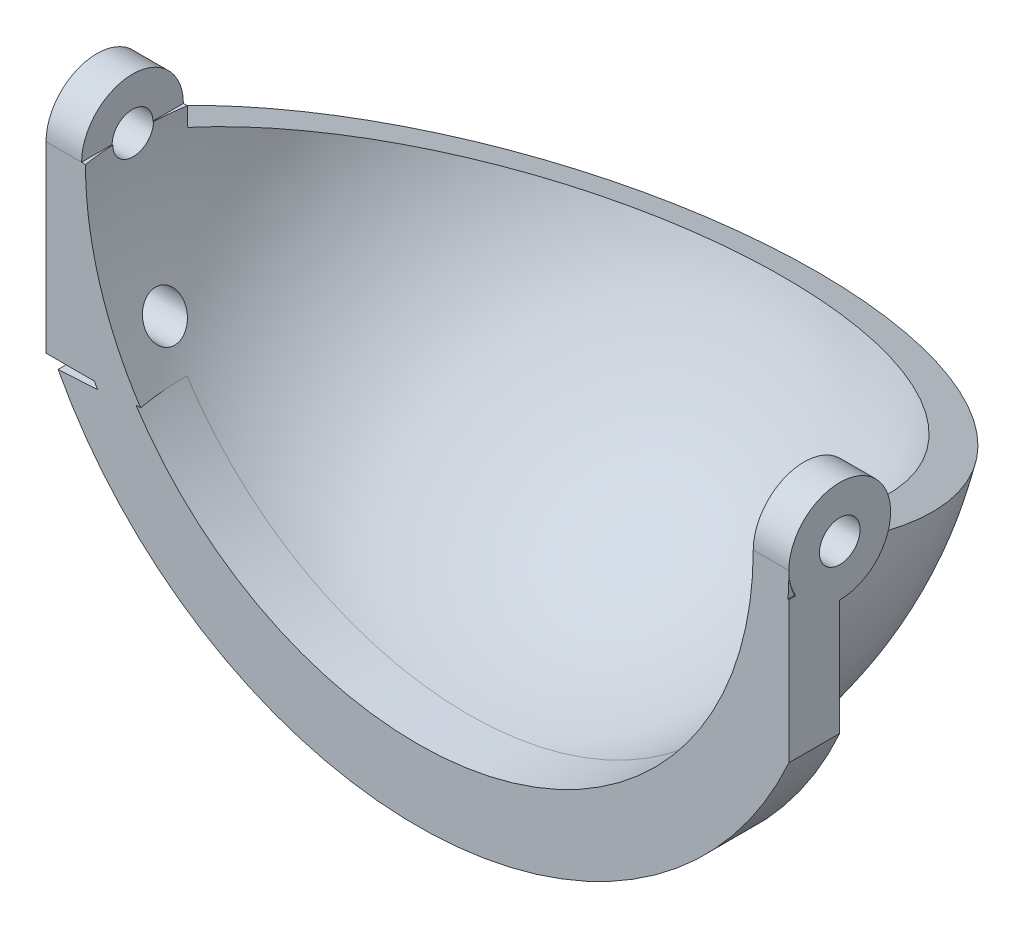
ISO-10303-21;
HEADER;
FILE_DESCRIPTION(('STEP AP214'),'2;1');
FILE_NAME('part.step','',(''),(''),'','','');
FILE_SCHEMA(('AUTOMOTIVE_DESIGN { 1 0 10303 214 1 1 1 1 }'));
ENDSEC;
DATA;
#1=APPLICATION_CONTEXT('core data for automotive mechanical design processes');
#2=APPLICATION_PROTOCOL_DEFINITION('international standard','automotive_design',2000,#1);
#3=PRODUCT_CONTEXT('',#1,'mechanical');
#4=PRODUCT('Part','Part','',(#3));
#5=PRODUCT_RELATED_PRODUCT_CATEGORY('part','',(#4));
#6=PRODUCT_DEFINITION_FORMATION('','',#4);
#7=PRODUCT_DEFINITION_CONTEXT('part definition',#1,'design');
#8=PRODUCT_DEFINITION('design','',#6,#7);
#9=PRODUCT_DEFINITION_SHAPE('','',#8);
#10=(LENGTH_UNIT() NAMED_UNIT(*) SI_UNIT(.MILLI.,.METRE.));
#11=(NAMED_UNIT(*) PLANE_ANGLE_UNIT() SI_UNIT($,.RADIAN.));
#12=(NAMED_UNIT(*) SI_UNIT($,.STERADIAN.) SOLID_ANGLE_UNIT());
#13=UNCERTAINTY_MEASURE_WITH_UNIT(LENGTH_MEASURE(1.E-05),#10,'distance_accuracy_value','');
#14=(GEOMETRIC_REPRESENTATION_CONTEXT(3) GLOBAL_UNCERTAINTY_ASSIGNED_CONTEXT((#13)) GLOBAL_UNIT_ASSIGNED_CONTEXT((#10,
#11,#12)) REPRESENTATION_CONTEXT('',''));
#15=CARTESIAN_POINT('',(0.,0.,0.));
#16=DIRECTION('',(0.,0.,1.));
#17=DIRECTION('',(1.,0.,0.));
#18=AXIS2_PLACEMENT_3D('',#15,#16,#17);
#19=CARTESIAN_POINT('',(0.,0.,2.5));
#20=DIRECTION('',(0.,0.,-1.));
#21=DIRECTION('',(-1.,0.,0.));
#22=AXIS2_PLACEMENT_3D('',#19,#20,#21);
#23=CYLINDRICAL_SURFACE('',#22,18.25);
#24=DIRECTION('',(0.,0.,-1.));
#25=VECTOR('',#24,1.);
#26=CARTESIAN_POINT('',(-15.7118029451725,-9.28448965813786,2.5));
#27=LINE('',#26,#25);
#28=CARTESIAN_POINT('',(-15.7118029451725,-9.28448965813786,2.5));
#29=VERTEX_POINT('',#28);
#30=CARTESIAN_POINT('',(-15.7118029451725,-9.28448965813786,0.));
#31=VERTEX_POINT('',#30);
#32=EDGE_CURVE('E228',#29,#31,#27,.T.);
#33=ORIENTED_EDGE('',*,*,#32,.F.);
#34=CARTESIAN_POINT('',(0.,0.,2.5));
#35=DIRECTION('',(0.,0.,1.));
#36=DIRECTION('',(1.,0.,0.));
#37=AXIS2_PLACEMENT_3D('',#34,#35,#36);
#38=CIRCLE('',#37,18.25);
#39=CARTESIAN_POINT('',(-15.8764763093074,-9.00000000000001,2.5));
#40=VERTEX_POINT('',#39);
#41=EDGE_CURVE('E385',#40,#29,#38,.T.);
#42=ORIENTED_EDGE('',*,*,#41,.F.);
#43=DIRECTION('',(0.,0.,-1.));
#44=VECTOR('',#43,1.);
#45=CARTESIAN_POINT('',(-15.8764763093074,-9.00000000000001,2.5));
#46=LINE('',#45,#44);
#47=CARTESIAN_POINT('',(-15.8764763093074,-9.00000000000001,0.));
#48=VERTEX_POINT('',#47);
#49=EDGE_CURVE('E292',#40,#48,#46,.T.);
#50=ORIENTED_EDGE('',*,*,#49,.T.);
#51=CARTESIAN_POINT('',(0.,0.,0.));
#52=DIRECTION('',(0.,0.,1.));
#53=DIRECTION('',(1.,0.,0.));
#54=AXIS2_PLACEMENT_3D('',#51,#52,#53);
#55=CIRCLE('',#54,18.25);
#56=EDGE_CURVE('E388',#48,#31,#55,.T.);
#57=ORIENTED_EDGE('',*,*,#56,.T.);
#58=EDGE_LOOP('',(#33,#42,#50,#57));
#59=FACE_BOUND('',#58,.T.);
#60=ADVANCED_FACE('F35',(#59),#23,.T.);
#61=DIRECTION('',(0.,0.,-1.));
#62=VECTOR('',#61,1.);
#63=CARTESIAN_POINT('',(18.2081881010628,-1.234660308066,2.5));
#64=LINE('',#63,#62);
#65=CARTESIAN_POINT('',(18.2081881010628,-1.234660308066,2.17384772320565));
#66=VERTEX_POINT('',#65);
#67=CARTESIAN_POINT('',(18.2081881010628,-1.234660308066,2.5));
#68=VERTEX_POINT('',#67);
#69=EDGE_CURVE('E193',#66,#68,#64,.F.);
#70=ORIENTED_EDGE('',*,*,#69,.F.);
#71=CARTESIAN_POINT('',(18.0779561897909,-2.5,0.));
#72=CARTESIAN_POINT('',(18.0779521570099,-2.50000712172084,0.0699656158708145));
#73=CARTESIAN_POINT('',(18.0783622769024,-2.49706294109357,0.139927587474474));
#74=CARTESIAN_POINT('',(18.0799810069445,-2.48532714554486,0.279344431731297));
#75=CARTESIAN_POINT('',(18.0811895507925,-2.47653601615712,0.348799346006648));
#76=CARTESIAN_POINT('',(18.0843735011698,-2.45317484259694,0.486635184812482));
#77=CARTESIAN_POINT('',(18.0863480290973,-2.43861141896833,0.555017246767177));
#78=CARTESIAN_POINT('',(18.0910036191342,-2.40382884624327,0.690282828633489));
#79=CARTESIAN_POINT('',(18.0936846778959,-2.3836097239455,0.75716635564407));
#80=CARTESIAN_POINT('',(18.1026816279781,-2.31464924061234,0.954905218171614));
#81=CARTESIAN_POINT('',(18.1099532632597,-2.25759117383518,1.08292849867273));
#82=CARTESIAN_POINT('',(18.126219441476,-2.12302381889561,1.32750969459837));
#83=CARTESIAN_POINT('',(18.1352139309721,-2.0455151650321,1.44406796546971));
#84=CARTESIAN_POINT('',(18.1539793096156,-1.87168459844453,1.66326956672154));
#85=CARTESIAN_POINT('',(18.16375443442,-1.77525523980031,1.76582747088945));
#86=CARTESIAN_POINT('',(18.1829430712477,-1.56653775618856,1.95336862147731));
#87=CARTESIAN_POINT('',(18.1923565138271,-1.45424660487692,2.03834850646377));
#88=CARTESIAN_POINT('',(18.209806264365,-1.21643593050015,2.18864276206281));
#89=CARTESIAN_POINT('',(18.217836596587,-1.09086261218281,2.25387267856655));
#90=CARTESIAN_POINT('',(18.2315610737766,-0.830441525078597,2.36225020163968));
#91=CARTESIAN_POINT('',(18.2372567095592,-0.695599739092576,2.40541190418471));
#92=CARTESIAN_POINT('',(18.2442634660599,-0.466632968904975,2.4578610049634));
#93=CARTESIAN_POINT('',(18.2464038580345,-0.373970279138573,2.47364943650924));
#94=CARTESIAN_POINT('',(18.2492766026278,-0.18755220887636,2.49471976005789));
#95=CARTESIAN_POINT('',(18.2500106778679,-0.0937983069053951,2.50001450622967));
#96=CARTESIAN_POINT('',(18.25,0.,2.5));
#97=B_SPLINE_CURVE_WITH_KNOTS('',3,(#71,#72,#73,#74,#75,#76,#77,#78,#79,#80,#81,#82,#83,#84,#85,
#86,#87,#88,#89,#90,#91,#92,#93,#94,#95,#96),.UNSPECIFIED.,.F.,.F.,(4,2,2,2,2,2,2,2,2,2,2,2,4),
(0.,0.20982725964795,0.419637097305098,0.629206986313711,0.838775882323268,1.2576742126176,
1.67655955181663,2.09789632693474,2.51931359968153,2.94250826673842,3.36543228128222,
3.64693451216615,3.92809170514547),.UNSPECIFIED.);
#98=CARTESIAN_POINT('',(18.25,0.,2.5));
#99=VERTEX_POINT('',#98);
#100=EDGE_CURVE('E335',#66,#99,#97,.T.);
#101=ORIENTED_EDGE('',*,*,#100,.T.);
#102=EDGE_CURVE('E397',#68,#99,#38,.T.);
#103=ORIENTED_EDGE('',*,*,#102,.F.);
#104=EDGE_LOOP('',(#70,#101,#103));
#105=FACE_BOUND('',#104,.T.);
#106=ADVANCED_FACE('F375',(#105),#23,.T.);
#107=CARTESIAN_POINT('',(-18.25,0.,0.));
#108=DIRECTION('',(1.,0.,0.));
#109=DIRECTION('',(0.,0.,-1.));
#110=AXIS2_PLACEMENT_3D('',#107,#108,#109);
#111=CYLINDRICAL_SURFACE('',#110,2.5);
#112=ORIENTED_EDGE('',*,*,#100,.F.);
#113=CARTESIAN_POINT('',(9.22059209697116,0.,0.));
#114=DIRECTION('',(-0.136095643510322,-0.990695702936836,0.));
#115=DIRECTION('',(0.990695702936836,-0.136095643510322,0.));
#116=AXIS2_PLACEMENT_3D('',#113,#114,#115);
#117=ELLIPSE('',#116,18.3694344324136,2.5);
#118=CARTESIAN_POINT('',(18.25,-1.24040416793677,2.17057538458472));
#119=VERTEX_POINT('',#118);
#120=EDGE_CURVE('E216',#66,#119,#117,.F.);
#121=ORIENTED_EDGE('',*,*,#120,.T.);
#122=CARTESIAN_POINT('',(18.25,0.,0.));
#123=DIRECTION('',(1.,0.,0.));
#124=DIRECTION('',(0.,0.,-1.));
#125=AXIS2_PLACEMENT_3D('',#122,#123,#124);
#126=CIRCLE('',#125,2.5);
#127=EDGE_CURVE('E179',#99,#119,#126,.T.);
#128=ORIENTED_EDGE('',*,*,#127,.F.);
#129=EDGE_LOOP('',(#112,#121,#128));
#130=FACE_BOUND('',#129,.T.);
#131=ADVANCED_FACE('F352',(#130),#111,.T.);
#132=CARTESIAN_POINT('',(18.25,0.,0.));
#133=DIRECTION('',(1.,0.,0.));
#134=DIRECTION('',(0.,0.,-1.));
#135=AXIS2_PLACEMENT_3D('',#132,#133,#134);
#136=PLANE('',#135);
#137=CARTESIAN_POINT('',(18.25,0.,0.));
#138=DIRECTION('',(1.,0.,0.));
#139=DIRECTION('',(0.,0.,-1.));
#140=AXIS2_PLACEMENT_3D('',#137,#138,#139);
#141=CIRCLE('',#140,1.);
#142=CARTESIAN_POINT('',(18.25,0.,-1.));
#143=VERTEX_POINT('',#142);
#144=EDGE_CURVE('E310',#143,#143,#141,.T.);
#145=ORIENTED_EDGE('',*,*,#144,.F.);
#146=EDGE_LOOP('',(#145));
#147=FACE_BOUND('',#146,.T.);
#148=ORIENTED_EDGE('',*,*,#127,.T.);
#149=DIRECTION('',(0.,0.,-1.));
#150=VECTOR('',#149,1.);
#151=CARTESIAN_POINT('',(18.25,-1.24040416793677,2.5));
#152=LINE('',#151,#150);
#153=CARTESIAN_POINT('',(18.25,-1.24040416793677,2.5));
#154=VERTEX_POINT('',#153);
#155=EDGE_CURVE('E175',#154,#119,#152,.T.);
#156=ORIENTED_EDGE('',*,*,#155,.F.);
#157=DIRECTION('',(0.,1.,0.));
#158=VECTOR('',#157,1.);
#159=CARTESIAN_POINT('',(18.25,-1.24040416793677,2.5));
#160=LINE('',#159,#158);
#161=CARTESIAN_POINT('',(18.25,-8.1815340859768,2.5));
#162=VERTEX_POINT('',#161);
#163=EDGE_CURVE('E50',#162,#154,#160,.T.);
#164=ORIENTED_EDGE('',*,*,#163,.F.);
#165=DIRECTION('',(0.,0.,-1.));
#166=VECTOR('',#165,1.);
#167=CARTESIAN_POINT('',(18.25,-8.1815340859768,2.5));
#168=LINE('',#167,#166);
#169=CARTESIAN_POINT('',(18.25,-8.1815340859768,0.));
#170=VERTEX_POINT('',#169);
#171=EDGE_CURVE('E11',#170,#162,#168,.F.);
#172=ORIENTED_EDGE('',*,*,#171,.F.);
#173=DIRECTION('',(0.,1.,0.));
#174=VECTOR('',#173,1.);
#175=CARTESIAN_POINT('',(18.25,-1.24040416793677,0.));
#176=LINE('',#175,#174);
#177=CARTESIAN_POINT('',(18.25,-2.5,0.));
#178=VERTEX_POINT('',#177);
#179=EDGE_CURVE('E189',#170,#178,#176,.T.);
#180=ORIENTED_EDGE('',*,*,#179,.T.);
#181=EDGE_CURVE('E314',#178,#99,#126,.T.);
#182=ORIENTED_EDGE('',*,*,#181,.T.);
#183=EDGE_LOOP('',(#148,#156,#164,#172,#180,#182));
#184=FACE_BOUND('',#183,.T.);
#185=ADVANCED_FACE('F176',(#147,#184),#136,.T.);
#186=CARTESIAN_POINT('',(16.5,0.,0.));
#187=DIRECTION('',(-1.,0.,0.));
#188=DIRECTION('',(0.,0.,1.));
#189=AXIS2_PLACEMENT_3D('',#186,#187,#188);
#190=CYLINDRICAL_SURFACE('',#189,2.5);
#191=CARTESIAN_POINT('',(16.5,0.,0.));
#192=DIRECTION('',(1.,0.,0.));
#193=DIRECTION('',(0.,0.,-1.));
#194=AXIS2_PLACEMENT_3D('',#191,#192,#193);
#195=CIRCLE('',#194,2.5);
#196=CARTESIAN_POINT('',(16.5,0.,2.5));
#197=VERTEX_POINT('',#196);
#198=CARTESIAN_POINT('',(16.5,-1.,2.29128784747792));
#199=VERTEX_POINT('',#198);
#200=EDGE_CURVE('E307',#197,#199,#195,.T.);
#201=ORIENTED_EDGE('',*,*,#200,.T.);
#202=CARTESIAN_POINT('',(16.5,-1.00000000000007,2.29128784747789));
#203=CARTESIAN_POINT('',(16.4960852572917,-1.06462073841594,2.26308437375634));
#204=CARTESIAN_POINT('',(16.4918611083284,-1.12800009207441,2.23216761376683));
#205=CARTESIAN_POINT('',(16.4829187974012,-1.25189279888322,2.16511675578543));
#206=CARTESIAN_POINT('',(16.4782006776612,-1.31240639635271,2.12898310362532));
#207=CARTESIAN_POINT('',(16.4635078075745,-1.48889338608551,2.01319171693076));
#208=CARTESIAN_POINT('',(16.45298063919,-1.60003129432423,1.92604795352568));
#209=CARTESIAN_POINT('',(16.4316459886746,-1.80604145442098,1.73437120898319));
#210=CARTESIAN_POINT('',(16.4208384410823,-1.90090986770302,1.62983413555105));
#211=CARTESIAN_POINT('',(16.4001549293034,-2.07179629853501,1.40621687086946));
#212=CARTESIAN_POINT('',(16.3902790525949,-2.14781254707124,1.28713531638615));
#213=CARTESIAN_POINT('',(16.3725734876946,-2.27886718865916,1.03762415322615));
#214=CARTESIAN_POINT('',(16.3647464333309,-2.33387862057358,0.907180221999875));
#215=CARTESIAN_POINT('',(16.3520701445957,-2.42110959635704,0.638810450758553));
#216=CARTESIAN_POINT('',(16.3472175998377,-2.45335448362612,0.500893114843996));
#217=CARTESIAN_POINT('',(16.3428051583639,-2.48249432011462,0.301497200569493));
#218=CARTESIAN_POINT('',(16.341805265421,-2.48906106325446,0.241331381202658));
#219=CARTESIAN_POINT('',(16.3404701950021,-2.49780877928634,0.120786296483244));
#220=CARTESIAN_POINT('',(16.3401337909583,-2.49999784513579,0.0604076320989441));
#221=CARTESIAN_POINT('',(16.3401346383682,-2.5,0.));
#222=B_SPLINE_CURVE_WITH_KNOTS('',3,(#202,#203,#204,#205,#206,#207,#208,#209,#210,#211,#212,
#213,#214,#215,#216,#217,#218,#219,#220,#221),.UNSPECIFIED.,.F.,.F.,(4,2,2,2,2,2,2,2,2,4),(0.,
0.21171480669659,0.423411531098545,0.846097917390899,1.26888389425232,1.69170952870509,
2.11507607915753,2.53797059763666,2.71943104334936,2.90055571413148),.UNSPECIFIED.);
#223=CARTESIAN_POINT('',(16.3401346383682,-2.5,0.));
#224=VERTEX_POINT('',#223);
#225=EDGE_CURVE('E219',#199,#224,#222,.T.);
#226=ORIENTED_EDGE('',*,*,#225,.T.);
#227=DIRECTION('',(-1.,0.,0.));
#228=VECTOR('',#227,1.);
#229=CARTESIAN_POINT('',(16.5,-2.5,0.));
#230=LINE('',#229,#228);
#231=CARTESIAN_POINT('',(16.5,-2.5,0.));
#232=VERTEX_POINT('',#231);
#233=EDGE_CURVE('E197',#232,#224,#230,.T.);
#234=ORIENTED_EDGE('',*,*,#233,.F.);
#235=CARTESIAN_POINT('',(16.5,-0.855050358314165,-2.34923155196477));
#236=VERTEX_POINT('',#235);
#237=EDGE_CURVE('E311',#232,#236,#195,.T.);
#238=ORIENTED_EDGE('',*,*,#237,.T.);
#239=DIRECTION('',(1.,0.,0.));
#240=VECTOR('',#239,1.);
#241=CARTESIAN_POINT('',(-18.25,-0.855050358314164,-2.34923155196477));
#242=LINE('',#241,#240);
#243=CARTESIAN_POINT('',(16.3095064303001,-0.855050358314165,-2.34923155196477));
#244=VERTEX_POINT('',#243);
#245=EDGE_CURVE('E419',#236,#244,#242,.F.);
#246=ORIENTED_EDGE('',*,*,#245,.T.);
#247=CARTESIAN_POINT('',(16.3095064303001,0.,0.));
#248=DIRECTION('',(-1.,0.,0.));
#249=DIRECTION('',(0.,0.,1.));
#250=AXIS2_PLACEMENT_3D('',#247,#248,#249);
#251=CIRCLE('',#250,2.5);
#252=CARTESIAN_POINT('',(16.3095064303001,-2.5,0.));
#253=VERTEX_POINT('',#252);
#254=EDGE_CURVE('E324',#253,#244,#251,.F.);
#255=ORIENTED_EDGE('',*,*,#254,.F.);
#256=CARTESIAN_POINT('',(16.5,0.,2.5));
#257=CARTESIAN_POINT('',(16.5000042822976,-0.0698916229030993,2.50000719613461));
#258=CARTESIAN_POINT('',(16.4995560155638,-0.139779524985285,2.49706915560411));
#259=CARTESIAN_POINT('',(16.4977860571789,-0.279047576709498,2.48535835119854));
#260=CARTESIAN_POINT('',(16.496464443498,-0.348427771119325,2.47658610818536));
#261=CARTESIAN_POINT('',(16.4929815792867,-0.486108730022606,2.45327685497405));
#262=CARTESIAN_POINT('',(16.4908213548877,-0.554410707946879,2.43874688952492));
#263=CARTESIAN_POINT('',(16.4857255271917,-0.689516835789526,2.40404613370944));
#264=CARTESIAN_POINT('',(16.4827899265762,-0.756320990886837,2.38387536285024));
#265=CARTESIAN_POINT('',(16.4729331119193,-0.953820250248171,2.31508515658809));
#266=CARTESIAN_POINT('',(16.4649596210465,-1.08168591845838,2.25817355014458));
#267=CARTESIAN_POINT('',(16.447091915851,-1.32598177851675,2.12396477046802));
#268=CARTESIAN_POINT('',(16.4371977090301,-1.44241201502577,2.04666767685442));
#269=CARTESIAN_POINT('',(16.4165009687513,-1.6615344818264,1.87321968423693));
#270=CARTESIAN_POINT('',(16.4056925723515,-1.76412505111955,1.77694083918376));
#271=CARTESIAN_POINT('',(16.3844298908483,-1.95176903616869,1.56852342361719));
#272=CARTESIAN_POINT('',(16.3739756750518,-2.03681903591637,1.45638177099344));
#273=CARTESIAN_POINT('',(16.3545466328297,-2.18737649820434,1.21872059698088));
#274=CARTESIAN_POINT('',(16.3455798876824,-2.25277867953414,1.09313373052068));
#275=CARTESIAN_POINT('',(16.3302300155237,-2.36148693294043,0.832626610740099));
#276=CARTESIAN_POINT('',(16.3238451963326,-2.40480748205934,0.69771253854168));
#277=CARTESIAN_POINT('',(16.3159709391764,-2.45754941353214,0.468338269302539));
#278=CARTESIAN_POINT('',(16.3135595914608,-2.47345351629617,0.375348614114591));
#279=CARTESIAN_POINT('',(16.3103219599252,-2.49468020946245,0.188253425670458));
#280=CARTESIAN_POINT('',(16.3094938204706,-2.50001518790886,0.0941493290097295));
#281=CARTESIAN_POINT('',(16.3095064303001,-2.5,0.));
#282=B_SPLINE_CURVE_WITH_KNOTS('',3,(#256,#257,#258,#259,#260,#261,#262,#263,#264,#265,#266,
#267,#268,#269,#270,#271,#272,#273,#274,#275,#276,#277,#278,#279,#280,#281),.UNSPECIFIED.,.F.,
.F.,(4,2,2,2,2,2,2,2,2,2,2,2,4),(0.,0.209605119241153,0.419191528013388,0.628522289309505,
0.837852326703047,1.25626058777456,1.67466721469585,2.0959969665502,2.51740869462916,
2.94103981828773,3.36439284477138,3.64693063564025,3.92913706828046),.UNSPECIFIED.);
#283=EDGE_CURVE('E327',#197,#253,#282,.T.);
#284=ORIENTED_EDGE('',*,*,#283,.F.);
#285=EDGE_LOOP('',(#201,#226,#234,#238,#246,#255,#284));
#286=FACE_BOUND('',#285,.T.);
#287=ADVANCED_FACE('F230',(#286),#190,.F.);
#288=CARTESIAN_POINT('',(16.5,0.,0.));
#289=DIRECTION('',(1.,0.,0.));
#290=DIRECTION('',(0.,0.,-1.));
#291=AXIS2_PLACEMENT_3D('',#288,#289,#290);
#292=PLANE('',#291);
#293=DIRECTION('',(0.,0.,-1.));
#294=VECTOR('',#293,1.);
#295=CARTESIAN_POINT('',(16.5,-1.,0.));
#296=LINE('',#295,#294);
#297=CARTESIAN_POINT('',(16.5,-1.,0.));
#298=VERTEX_POINT('',#297);
#299=EDGE_CURVE('E43',#199,#298,#296,.T.);
#300=ORIENTED_EDGE('',*,*,#299,.F.);
#301=ORIENTED_EDGE('',*,*,#200,.F.);
#302=EDGE_CURVE('E306',#236,#197,#195,.T.);
#303=ORIENTED_EDGE('',*,*,#302,.F.);
#304=ORIENTED_EDGE('',*,*,#237,.F.);
#305=DIRECTION('',(0.,1.,0.));
#306=VECTOR('',#305,1.);
#307=CARTESIAN_POINT('',(16.5,0.,0.));
#308=LINE('',#307,#306);
#309=EDGE_CURVE('E434',#232,#298,#308,.T.);
#310=ORIENTED_EDGE('',*,*,#309,.T.);
#311=CARTESIAN_POINT('',(16.5,0.,0.));
#312=DIRECTION('',(1.,0.,0.));
#313=DIRECTION('',(0.,0.,-1.));
#314=AXIS2_PLACEMENT_3D('',#311,#312,#313);
#315=CIRCLE('',#314,1.);
#316=EDGE_CURVE('E303',#298,#298,#315,.T.);
#317=ORIENTED_EDGE('',*,*,#316,.T.);
#318=EDGE_LOOP('',(#300,#301,#303,#304,#310,#317));
#319=FACE_BOUND('',#318,.T.);
#320=ADVANCED_FACE('F440',(#319),#292,.F.);
#321=CARTESIAN_POINT('',(-18.25,0.,0.));
#322=DIRECTION('',(1.,0.,0.));
#323=DIRECTION('',(0.,0.,-1.));
#324=AXIS2_PLACEMENT_3D('',#321,#322,#323);
#325=CYLINDRICAL_SURFACE('',#324,1.);
#326=CARTESIAN_POINT('',(-18.25,0.,0.));
#327=DIRECTION('',(1.,0.,0.));
#328=DIRECTION('',(0.,0.,-1.));
#329=AXIS2_PLACEMENT_3D('',#326,#327,#328);
#330=CIRCLE('',#329,1.);
#331=CARTESIAN_POINT('',(-18.25,0.,-1.));
#332=VERTEX_POINT('',#331);
#333=EDGE_CURVE('E316',#332,#332,#330,.T.);
#334=ORIENTED_EDGE('',*,*,#333,.F.);
#335=EDGE_LOOP('',(#334));
#336=FACE_BOUND('',#335,.T.);
#337=CARTESIAN_POINT('',(-16.4696690920006,0.,0.));
#338=DIRECTION('',(1.,0.,0.));
#339=DIRECTION('',(0.,0.,-1.));
#340=AXIS2_PLACEMENT_3D('',#337,#338,#339);
#341=CIRCLE('',#340,1.);
#342=CARTESIAN_POINT('',(-16.4696690920006,0.,-1.));
#343=VERTEX_POINT('',#342);
#344=CARTESIAN_POINT('',(-16.4696690920006,0.,1.));
#345=VERTEX_POINT('',#344);
#346=EDGE_CURVE('E506',#343,#345,#341,.F.);
#347=ORIENTED_EDGE('',*,*,#346,.F.);
#348=DIRECTION('',(-1.,0.,0.));
#349=VECTOR('',#348,1.);
#350=CARTESIAN_POINT('',(-13.25,0.,-1.));
#351=LINE('',#350,#349);
#352=CARTESIAN_POINT('',(-16.5,0.,-1.));
#353=VERTEX_POINT('',#352);
#354=EDGE_CURVE('E270',#343,#353,#351,.T.);
#355=ORIENTED_EDGE('',*,*,#354,.T.);
#356=CARTESIAN_POINT('',(-16.5,0.,0.));
#357=DIRECTION('',(1.,0.,0.));
#358=DIRECTION('',(0.,0.,-1.));
#359=AXIS2_PLACEMENT_3D('',#356,#357,#358);
#360=CIRCLE('',#359,1.);
#361=CARTESIAN_POINT('',(-16.5,0.,1.));
#362=VERTEX_POINT('',#361);
#363=EDGE_CURVE('E297',#353,#362,#360,.T.);
#364=ORIENTED_EDGE('',*,*,#363,.T.);
#365=DIRECTION('',(-1.,0.,0.));
#366=VECTOR('',#365,1.);
#367=CARTESIAN_POINT('',(-13.25,0.,1.));
#368=LINE('',#367,#366);
#369=EDGE_CURVE('E271',#345,#362,#368,.T.);
#370=ORIENTED_EDGE('',*,*,#369,.F.);
#371=EDGE_LOOP('',(#347,#355,#364,#370));
#372=FACE_BOUND('',#371,.T.);
#373=ADVANCED_FACE('F504',(#336,#372),#325,.F.);
#374=CARTESIAN_POINT('',(-13.25,-7.,0.));
#375=DIRECTION('',(-1.,0.,0.));
#376=DIRECTION('',(0.,0.,1.));
#377=AXIS2_PLACEMENT_3D('',#374,#375,#376);
#378=CYLINDRICAL_SURFACE('',#377,1.);
#379=CARTESIAN_POINT('',(-18.25,-7.,0.));
#380=DIRECTION('',(-1.,0.,0.));
#381=DIRECTION('',(0.,0.,1.));
#382=AXIS2_PLACEMENT_3D('',#379,#380,#381);
#383=CIRCLE('',#382,1.);
#384=CARTESIAN_POINT('',(-18.25,-7.,1.));
#385=VERTEX_POINT('',#384);
#386=EDGE_CURVE('E256',#385,#385,#383,.T.);
#387=ORIENTED_EDGE('',*,*,#386,.T.);
#388=EDGE_LOOP('',(#387));
#389=FACE_BOUND('',#388,.T.);
#390=CARTESIAN_POINT('',(-14.6522600819762,-7.54009103500896,-0.841606602815689));
#391=CARTESIAN_POINT('',(-14.6301891522728,-7.58628941258799,-0.811958104006606));
#392=CARTESIAN_POINT('',(-14.6090707882658,-7.6303887674055,-0.778280122379135));
#393=CARTESIAN_POINT('',(-14.5694195239184,-7.71302920066059,-0.703350116036169));
#394=CARTESIAN_POINT('',(-14.5508878458591,-7.7515676517049,-0.662094531872712));
#395=CARTESIAN_POINT('',(-14.5170637863728,-7.82179620243837,-0.572622529030842));
#396=CARTESIAN_POINT('',(-14.5017847440056,-7.85345811175945,-0.524378760057002));
#397=CARTESIAN_POINT('',(-14.4752826587798,-7.90831205777243,-0.422281620024672));
#398=CARTESIAN_POINT('',(-14.4640572941148,-7.93150894301815,-0.368431482945035));
#399=CARTESIAN_POINT('',(-14.4469338777,-7.96686926522679,-0.260996323176108));
#400=CARTESIAN_POINT('',(-14.4406993423628,-7.97972988962042,-0.207694490772344));
#401=CARTESIAN_POINT('',(-14.432541509852,-7.99655449315419,-0.099388627838632));
#402=CARTESIAN_POINT('',(-14.4306162772115,-8.00052246631312,-0.0443853727387857));
#403=CARTESIAN_POINT('',(-14.431157996854,-7.99940559917081,0.0617441679593134));
#404=CARTESIAN_POINT('',(-14.4333349190278,-7.99491854602219,0.112879522043158));
#405=CARTESIAN_POINT('',(-14.4414122911393,-7.97825908108743,0.213571166368605));
#406=CARTESIAN_POINT('',(-14.4473124598244,-7.96608724980631,0.263127575586059));
#407=CARTESIAN_POINT('',(-14.462556351473,-7.93460865432854,0.359250993347403));
#408=CARTESIAN_POINT('',(-14.4718943667137,-7.91531371620318,0.405822807477365));
#409=CARTESIAN_POINT('',(-14.4936337635263,-7.87033557450822,0.49498605754592));
#410=CARTESIAN_POINT('',(-14.5060357825295,-7.84465104164791,0.537576662694454));
#411=CARTESIAN_POINT('',(-14.5342903584256,-7.78604389527015,0.620371020472353));
#412=CARTESIAN_POINT('',(-14.5503060462775,-7.75277788129454,0.6602753724947));
#413=CARTESIAN_POINT('',(-14.5847370875599,-7.68112431836945,0.733971551053615));
#414=CARTESIAN_POINT('',(-14.6031533181631,-7.64273489717357,0.767761132384543));
#415=CARTESIAN_POINT('',(-14.6436790730364,-7.55807932537444,0.831634934685883));
#416=CARTESIAN_POINT('',(-14.6659730920979,-7.51141182483388,0.861070024669253));
#417=CARTESIAN_POINT('',(-14.7121456140872,-7.41452179252725,0.911681209640171));
#418=CARTESIAN_POINT('',(-14.7360247672057,-7.36429780138768,0.932853890748793));
#419=CARTESIAN_POINT('',(-14.7870030405325,-7.25680340725515,0.968266202742461));
#420=CARTESIAN_POINT('',(-14.8141966944709,-7.19930906446011,0.981692593677323));
#421=CARTESIAN_POINT('',(-14.8690270100836,-7.08305631075793,0.998274526383616));
#422=CARTESIAN_POINT('',(-14.8966638223136,-7.02429746783483,1.00142649997421));
#423=CARTESIAN_POINT('',(-14.9531293633742,-6.90391141711932,0.997286939142773));
#424=CARTESIAN_POINT('',(-14.98194433052,-6.84229588963881,0.989437405248878));
#425=CARTESIAN_POINT('',(-15.0384722170338,-6.72108233577899,0.962321141789697));
#426=CARTESIAN_POINT('',(-15.0661850297267,-6.66148450477097,0.943053309926999));
#427=CARTESIAN_POINT('',(-15.1193725997811,-6.54680516194737,0.893572728725836));
#428=CARTESIAN_POINT('',(-15.1448680394033,-6.4916823303235,0.863478660827794));
#429=CARTESIAN_POINT('',(-15.1930653020794,-6.38723911862297,0.792777021762654));
#430=CARTESIAN_POINT('',(-15.2157682270192,-6.33791645022561,0.752173617187331));
#431=CARTESIAN_POINT('',(-15.2559752847428,-6.25039959774309,0.664572325015458));
#432=CARTESIAN_POINT('',(-15.2737342812165,-6.21166351983796,0.618234329207092));
#433=CARTESIAN_POINT('',(-15.3052973088011,-6.14272315989743,0.518408451508175));
#434=CARTESIAN_POINT('',(-15.3191042391059,-6.11251262384487,0.464925853286156));
#435=CARTESIAN_POINT('',(-15.3409773224471,-6.06460879573005,0.357964657701802));
#436=CARTESIAN_POINT('',(-15.3494705926481,-6.04598520984654,0.3049894701033));
#437=CARTESIAN_POINT('',(-15.3623050435264,-6.0178304078401,0.196199160136429));
#438=CARTESIAN_POINT('',(-15.3666484734212,-6.00829426632082,0.140385593470061));
#439=CARTESIAN_POINT('',(-15.3708166325627,-5.99914283854175,0.0319810400351587));
#440=CARTESIAN_POINT('',(-15.370952988151,-5.99884337386403,-0.0205414431995759));
#441=CARTESIAN_POINT('',(-15.3674890447046,-6.00644881917678,-0.124857199621977));
#442=CARTESIAN_POINT('',(-15.3638893792445,-6.01435233806101,-0.176650594942805));
#443=CARTESIAN_POINT('',(-15.3532097117532,-6.03778421424536,-0.277033141341849));
#444=CARTESIAN_POINT('',(-15.3461979395131,-6.05316308505025,-0.32566474775296));
#445=CARTESIAN_POINT('',(-15.3289938235046,-6.09085871165048,-0.419549925440149));
#446=CARTESIAN_POINT('',(-15.3188011040907,-6.11317628685235,-0.46480309696645));
#447=CARTESIAN_POINT('',(-15.2951406256764,-6.16491556753846,-0.552564091799815));
#448=CARTESIAN_POINT('',(-15.281562577994,-6.19457620477232,-0.5949008688989));
#449=CARTESIAN_POINT('',(-15.2517986487284,-6.25948994524121,-0.67399177151991));
#450=CARTESIAN_POINT('',(-15.2356119816493,-6.29474473291282,-0.71074420901351));
#451=CARTESIAN_POINT('',(-15.1997407331314,-6.37273051089346,-0.780695742970098));
#452=CARTESIAN_POINT('',(-15.1798817751124,-6.41583019336524,-0.813393896096664));
#453=CARTESIAN_POINT('',(-15.1382300795198,-6.50603029134359,-0.871128347011511));
#454=CARTESIAN_POINT('',(-15.1164366852412,-6.55313206525172,-0.896162029923908));
#455=CARTESIAN_POINT('',(-15.0694175757607,-6.65451816616526,-0.940194268992614));
#456=CARTESIAN_POINT('',(-15.0440596418554,-6.70906696729154,-0.958443421072922));
#457=CARTESIAN_POINT('',(-14.9923343685756,-6.82004142025044,-0.985331538291533));
#458=CARTESIAN_POINT('',(-14.9659664316637,-6.87646818044872,-0.993964720682754));
#459=CARTESIAN_POINT('',(-14.9109794008884,-6.99382150376781,-1.00182870641906));
#460=CARTESIAN_POINT('',(-14.8823332038869,-7.05478355685572,-1.00034978898725));
#461=CARTESIAN_POINT('',(-14.8254147002443,-7.17556338869688,-0.986340999789761));
#462=CARTESIAN_POINT('',(-14.7971421122631,-7.23538204564503,-0.973819988649988));
#463=CARTESIAN_POINT('',(-14.7490631715519,-7.33682527006978,-0.942644340736738));
#464=CARTESIAN_POINT('',(-14.7289856292561,-7.379097610293,-0.926468602844405));
#465=CARTESIAN_POINT('',(-14.6898038696386,-7.46143183335263,-0.888334486898157));
#466=CARTESIAN_POINT('',(-14.6706995309902,-7.50149399177851,-0.866376831776528));
#467=CARTESIAN_POINT('',(-14.6522600819762,-7.54009103500896,-0.841606602815689));
#468=B_SPLINE_CURVE_WITH_KNOTS('',3,(#390,#391,#392,#393,#394,#395,#396,#397,#398,#399,#400,
#401,#402,#403,#404,#405,#406,#407,#408,#409,#410,#411,#412,#413,#414,#415,#416,#417,#418,#419,
#420,#421,#422,#423,#424,#425,#426,#427,#428,#429,#430,#431,#432,#433,#434,#435,#436,#437,#438,
#439,#440,#441,#442,#443,#444,#445,#446,#447,#448,#449,#450,#451,#452,#453,#454,#455,#456,#457,
#458,#459,#460,#461,#462,#463,#464,#465,#466,#467),.UNSPECIFIED.,.T.,.F.,(4,2,2,2,2,2,2,2,2,2,2,
2,2,2,2,2,2,2,2,2,2,2,2,2,2,2,2,2,2,2,2,2,2,2,2,2,2,2,4),(0.,0.177336296410358,
0.354756107514137,0.532890068226147,0.710921837522901,0.875597422590261,1.04019903092219,
1.19359721629395,1.34698381541541,1.5001168928094,1.65328185467553,1.81569507949234,
1.97816781831085,2.15594951314568,2.33380458660463,2.52795976919008,2.72218237234159,
2.92662018669249,3.13107774023682,3.33335903326865,3.53556025121868,3.72338520670256,
3.91107202056684,4.08054271926699,4.24992151248994,4.40672137588793,4.56349465266271,
4.71725440153301,4.8710323151242,5.03068798232884,5.1903918144806,5.3625556563481,
5.53477816981276,5.72255735561175,5.9104494051451,6.11165760336479,6.31270449069146,
6.4608809542086,6.60903889952103),.UNSPECIFIED.);
#469=CARTESIAN_POINT('',(-14.6522600819762,-7.54009103500896,-0.841606602815689));
#470=VERTEX_POINT('',#469);
#471=EDGE_CURVE('E249',#470,#470,#468,.T.);
#472=ORIENTED_EDGE('',*,*,#471,.F.);
#473=EDGE_LOOP('',(#472));
#474=FACE_BOUND('',#473,.T.);
#475=ADVANCED_FACE('F245',(#389,#474),#378,.F.);
#476=CARTESIAN_POINT('',(-13.25,-9.00000000000001,-2.5));
#477=DIRECTION('',(0.,0.,-1.));
#478=DIRECTION('',(-1.,0.,0.));
#479=AXIS2_PLACEMENT_3D('',#476,#477,#478);
#480=PLANE('',#479);
#481=DIRECTION('',(-1.,0.,0.));
#482=VECTOR('',#481,1.);
#483=CARTESIAN_POINT('',(-13.25,0.,-2.5));
#484=LINE('',#483,#482);
#485=CARTESIAN_POINT('',(-16.3095064303001,0.,-2.5));
#486=VERTEX_POINT('',#485);
#487=CARTESIAN_POINT('',(-16.5,0.,-2.5));
#488=VERTEX_POINT('',#487);
#489=EDGE_CURVE('E281',#486,#488,#484,.T.);
#490=ORIENTED_EDGE('',*,*,#489,.F.);
#491=CARTESIAN_POINT('',(0.,0.,-2.5));
#492=DIRECTION('',(0.,0.,-1.));
#493=DIRECTION('',(-1.,0.,0.));
#494=AXIS2_PLACEMENT_3D('',#491,#492,#493);
#495=CIRCLE('',#494,16.3095064303001);
#496=CARTESIAN_POINT('',(-16.2841037649774,-0.909925585665497,-2.5));
#497=VERTEX_POINT('',#496);
#498=EDGE_CURVE('E392',#486,#497,#495,.F.);
#499=ORIENTED_EDGE('',*,*,#498,.T.);
#500=DIRECTION('',(-1.,0.,0.));
#501=VECTOR('',#500,1.);
#502=CARTESIAN_POINT('',(0.,-0.909925585665497,-2.5));
#503=LINE('',#502,#501);
#504=CARTESIAN_POINT('',(-18.0550418284908,-0.909925585665497,-2.5));
#505=VERTEX_POINT('',#504);
#506=EDGE_CURVE('E287',#497,#505,#503,.T.);
#507=ORIENTED_EDGE('',*,*,#506,.T.);
#508=CARTESIAN_POINT('',(0.,0.,-2.5));
#509=DIRECTION('',(0.,0.,-1.));
#510=DIRECTION('',(-1.,0.,0.));
#511=AXIS2_PLACEMENT_3D('',#508,#509,#510);
#512=CIRCLE('',#511,18.0779561897909);
#513=CARTESIAN_POINT('',(-15.6784087202751,-9.00000000000001,-2.5));
#514=VERTEX_POINT('',#513);
#515=EDGE_CURVE('E290',#514,#505,#512,.T.);
#516=ORIENTED_EDGE('',*,*,#515,.F.);
#517=DIRECTION('',(-1.,0.,0.));
#518=VECTOR('',#517,1.);
#519=CARTESIAN_POINT('',(-13.25,-9.00000000000001,-2.5));
#520=LINE('',#519,#518);
#521=CARTESIAN_POINT('',(-18.25,-9.00000000000001,-2.5));
#522=VERTEX_POINT('',#521);
#523=EDGE_CURVE('E279',#514,#522,#520,.T.);
#524=ORIENTED_EDGE('',*,*,#523,.T.);
#525=DIRECTION('',(0.,-1.,0.));
#526=VECTOR('',#525,1.);
#527=CARTESIAN_POINT('',(-18.25,-9.00000000000001,-2.5));
#528=LINE('',#527,#526);
#529=CARTESIAN_POINT('',(-18.25,0.,-2.5));
#530=VERTEX_POINT('',#529);
#531=EDGE_CURVE('E261',#530,#522,#528,.T.);
#532=ORIENTED_EDGE('',*,*,#531,.F.);
#533=EDGE_CURVE('E283',#488,#530,#484,.T.);
#534=ORIENTED_EDGE('',*,*,#533,.F.);
#535=EDGE_LOOP('',(#490,#499,#507,#516,#524,#532,#534));
#536=FACE_BOUND('',#535,.T.);
#537=ADVANCED_FACE('F471',(#536),#480,.T.);
#538=ORIENTED_EDGE('',*,*,#533,.T.);
#539=CARTESIAN_POINT('',(-18.25,0.,0.));
#540=DIRECTION('',(1.,0.,0.));
#541=DIRECTION('',(0.,0.,-1.));
#542=AXIS2_PLACEMENT_3D('',#539,#540,#541);
#543=CIRCLE('',#542,2.5);
#544=CARTESIAN_POINT('',(-18.25,0.,2.5));
#545=VERTEX_POINT('',#544);
#546=EDGE_CURVE('E319',#530,#545,#543,.T.);
#547=ORIENTED_EDGE('',*,*,#546,.T.);
#548=DIRECTION('',(-1.,0.,0.));
#549=VECTOR('',#548,1.);
#550=CARTESIAN_POINT('',(-18.25,0.,2.5));
#551=LINE('',#550,#549);
#552=CARTESIAN_POINT('',(-16.5,0.,2.5));
#553=VERTEX_POINT('',#552);
#554=EDGE_CURVE('E425',#553,#545,#551,.T.);
#555=ORIENTED_EDGE('',*,*,#554,.F.);
#556=CARTESIAN_POINT('',(-16.5,0.,0.));
#557=DIRECTION('',(1.,0.,0.));
#558=DIRECTION('',(0.,0.,-1.));
#559=AXIS2_PLACEMENT_3D('',#556,#557,#558);
#560=CIRCLE('',#559,2.5);
#561=EDGE_CURVE('E300',#488,#553,#560,.T.);
#562=ORIENTED_EDGE('',*,*,#561,.F.);
#563=EDGE_LOOP('',(#538,#547,#555,#562));
#564=FACE_BOUND('',#563,.T.);
#565=ADVANCED_FACE('F353',(#564),#111,.T.);
#566=CARTESIAN_POINT('',(0.,0.,2.5));
#567=DIRECTION('',(0.,0.,-1.));
#568=DIRECTION('',(-1.,0.,0.));
#569=AXIS2_PLACEMENT_3D('',#566,#567,#568);
#570=CYLINDRICAL_SURFACE('',#569,16.5);
#571=CARTESIAN_POINT('',(0.,0.,0.));
#572=DIRECTION('',(0.,0.,-1.));
#573=DIRECTION('',(1.,0.,0.));
#574=AXIS2_PLACEMENT_3D('',#571,#572,#573);
#575=CIRCLE('',#574,16.5);
#576=CARTESIAN_POINT('',(-13.8293166859393,-9.,0.));
#577=VERTEX_POINT('',#576);
#578=EDGE_CURVE('E427',#253,#577,#575,.T.);
#579=ORIENTED_EDGE('',*,*,#578,.T.);
#580=DIRECTION('',(0.,0.,-1.));
#581=VECTOR('',#580,1.);
#582=CARTESIAN_POINT('',(-13.8293166859393,-9.00000000000001,2.5));
#583=LINE('',#582,#581);
#584=CARTESIAN_POINT('',(-13.8293166859393,-9.00000000000001,2.5));
#585=VERTEX_POINT('',#584);
#586=EDGE_CURVE('E294',#577,#585,#583,.F.);
#587=ORIENTED_EDGE('',*,*,#586,.T.);
#588=CARTESIAN_POINT('',(0.,0.,2.5));
#589=DIRECTION('',(0.,0.,-1.));
#590=DIRECTION('',(1.,0.,0.));
#591=AXIS2_PLACEMENT_3D('',#588,#589,#590);
#592=CIRCLE('',#591,16.5);
#593=EDGE_CURVE('E458',#197,#585,#592,.T.);
#594=ORIENTED_EDGE('',*,*,#593,.F.);
#595=ORIENTED_EDGE('',*,*,#283,.T.);
#596=EDGE_LOOP('',(#579,#587,#594,#595));
#597=FACE_BOUND('',#596,.T.);
#598=ADVANCED_FACE('F341',(#597),#570,.F.);
#599=CARTESIAN_POINT('',(0.,0.,2.5));
#600=DIRECTION('',(0.,0.,1.));
#601=DIRECTION('',(1.,0.,0.));
#602=AXIS2_PLACEMENT_3D('',#599,#600,#601);
#603=PLANE('',#602);
#604=ORIENTED_EDGE('',*,*,#163,.T.);
#605=DIRECTION('',(-0.990695702936836,0.136095643510322,0.));
#606=VECTOR('',#605,1.);
#607=CARTESIAN_POINT('',(16.5,-1.,2.5));
#608=LINE('',#607,#606);
#609=EDGE_CURVE('E56',#154,#68,#608,.T.);
#610=ORIENTED_EDGE('',*,*,#609,.T.);
#611=ORIENTED_EDGE('',*,*,#102,.T.);
#612=DIRECTION('',(-1.,0.,0.));
#613=VECTOR('',#612,1.);
#614=CARTESIAN_POINT('',(16.5,0.,2.5));
#615=LINE('',#614,#613);
#616=EDGE_CURVE('E396',#99,#197,#615,.T.);
#617=ORIENTED_EDGE('',*,*,#616,.T.);
#618=ORIENTED_EDGE('',*,*,#593,.T.);
#619=DIRECTION('',(-1.,0.,0.));
#620=VECTOR('',#619,1.);
#621=CARTESIAN_POINT('',(-13.25,-9.00000000000001,2.5));
#622=LINE('',#621,#620);
#623=CARTESIAN_POINT('',(-13.6014705087354,-9.00000000000001,2.5));
#624=VERTEX_POINT('',#623);
#625=EDGE_CURVE('E276',#624,#585,#622,.T.);
#626=ORIENTED_EDGE('',*,*,#625,.F.);
#627=CARTESIAN_POINT('',(0.,0.,2.5));
#628=DIRECTION('',(0.,0.,1.));
#629=DIRECTION('',(1.,0.,0.));
#630=AXIS2_PLACEMENT_3D('',#627,#628,#629);
#631=CIRCLE('',#630,16.3095064303001);
#632=CARTESIAN_POINT('',(-16.3095064303001,0.,2.5));
#633=VERTEX_POINT('',#632);
#634=EDGE_CURVE('E512',#624,#633,#631,.F.);
#635=ORIENTED_EDGE('',*,*,#634,.T.);
#636=DIRECTION('',(-1.,0.,0.));
#637=VECTOR('',#636,1.);
#638=CARTESIAN_POINT('',(-13.25,0.,2.5));
#639=LINE('',#638,#637);
#640=EDGE_CURVE('E274',#633,#553,#639,.T.);
#641=ORIENTED_EDGE('',*,*,#640,.T.);
#642=ORIENTED_EDGE('',*,*,#554,.T.);
#643=DIRECTION('',(0.,1.,0.));
#644=VECTOR('',#643,1.);
#645=CARTESIAN_POINT('',(-18.25,0.,2.5));
#646=LINE('',#645,#644);
#647=CARTESIAN_POINT('',(-18.25,-9.00000000000001,2.5));
#648=VERTEX_POINT('',#647);
#649=EDGE_CURVE('E267',#648,#545,#646,.T.);
#650=ORIENTED_EDGE('',*,*,#649,.F.);
#651=EDGE_CURVE('E278',#40,#648,#622,.T.);
#652=ORIENTED_EDGE('',*,*,#651,.F.);
#653=ORIENTED_EDGE('',*,*,#41,.T.);
#654=DIRECTION('',(-0.998451230054847,-0.055633993223234,0.));
#655=VECTOR('',#654,1.);
#656=CARTESIAN_POINT('',(-13.7501268882711,-9.17518449713382,2.5));
#657=LINE('',#656,#655);
#658=CARTESIAN_POINT('',(-17.657116061474,-9.39288307132786,2.5));
#659=VERTEX_POINT('',#658);
#660=EDGE_CURVE('E199',#29,#659,#657,.T.);
#661=ORIENTED_EDGE('',*,*,#660,.T.);
#662=CARTESIAN_POINT('',(0.,0.,2.5));
#663=DIRECTION('',(0.,0.,1.));
#664=DIRECTION('',(-1.,0.,0.));
#665=AXIS2_PLACEMENT_3D('',#662,#663,#664);
#666=CIRCLE('',#665,20.);
#667=EDGE_CURVE('E188',#659,#162,#666,.T.);
#668=ORIENTED_EDGE('',*,*,#667,.T.);
#669=EDGE_LOOP('',(#604,#610,#611,#617,#618,#626,#635,#641,#642,#650,#652,#653,#661,#668));
#670=FACE_BOUND('',#669,.T.);
#671=ADVANCED_FACE('F186',(#670),#603,.T.);
#672=CARTESIAN_POINT('',(0.,0.,0.));
#673=DIRECTION('',(-1.,0.,0.));
#674=DIRECTION('',(0.,-0.342020143325666,-0.939692620785909));
#675=AXIS2_PLACEMENT_3D('',#672,#673,#674);
#676=SPHERICAL_SURFACE('',#675,16.5);
#677=CARTESIAN_POINT('',(0.,-9.00000000000001,0.));
#678=DIRECTION('',(0.,-1.,0.));
#679=DIRECTION('',(0.,0.,-1.));
#680=AXIS2_PLACEMENT_3D('',#677,#678,#679);
#681=CIRCLE('',#680,13.8293166859393);
#682=EDGE_CURVE('E257',#577,#624,#681,.F.);
#683=ORIENTED_EDGE('',*,*,#682,.F.);
#684=ORIENTED_EDGE('',*,*,#578,.F.);
#685=ORIENTED_EDGE('',*,*,#254,.T.);
#686=CARTESIAN_POINT('',(0.,0.,0.));
#687=DIRECTION('',(0.,-0.939692620785909,0.342020143325666));
#688=DIRECTION('',(-1.,0.,0.));
#689=AXIS2_PLACEMENT_3D('',#686,#687,#688);
#690=CIRCLE('',#689,16.5);
#691=EDGE_CURVE('E448',#497,#244,#690,.T.);
#692=ORIENTED_EDGE('',*,*,#691,.F.);
#693=ORIENTED_EDGE('',*,*,#498,.F.);
#694=CARTESIAN_POINT('',(0.,0.,0.));
#695=DIRECTION('',(0.,1.,0.));
#696=DIRECTION('',(0.,0.,1.));
#697=AXIS2_PLACEMENT_3D('',#694,#695,#696);
#698=CIRCLE('',#697,16.5);
#699=EDGE_CURVE('E431',#343,#486,#698,.F.);
#700=ORIENTED_EDGE('',*,*,#699,.F.);
#701=ORIENTED_EDGE('',*,*,#346,.T.);
#702=CARTESIAN_POINT('',(0.,0.,0.));
#703=DIRECTION('',(0.,1.,0.));
#704=DIRECTION('',(0.,0.,1.));
#705=AXIS2_PLACEMENT_3D('',#702,#703,#704);
#706=CIRCLE('',#705,16.5);
#707=EDGE_CURVE('E509',#633,#345,#706,.F.);
#708=ORIENTED_EDGE('',*,*,#707,.F.);
#709=ORIENTED_EDGE('',*,*,#634,.F.);
#710=EDGE_LOOP('',(#683,#684,#685,#692,#693,#700,#701,#708,#709));
#711=FACE_BOUND('',#710,.T.);
#712=ORIENTED_EDGE('',*,*,#471,.T.);
#713=EDGE_LOOP('',(#712));
#714=FACE_BOUND('',#713,.T.);
#715=ADVANCED_FACE('F361',(#711,#714),#676,.F.);
#716=CARTESIAN_POINT('',(0.,0.,0.));
#717=DIRECTION('',(-1.,0.,0.));
#718=DIRECTION('',(0.,-0.342020143325666,-0.939692620785909));
#719=AXIS2_PLACEMENT_3D('',#716,#717,#718);
#720=SPHERICAL_SURFACE('',#719,18.25);
#721=ORIENTED_EDGE('',*,*,#56,.F.);
#722=CARTESIAN_POINT('',(0.,-9.00000000000001,0.));
#723=DIRECTION('',(0.,-1.,0.));
#724=DIRECTION('',(0.,0.,-1.));
#725=AXIS2_PLACEMENT_3D('',#722,#723,#724);
#726=CIRCLE('',#725,15.8764763093074);
#727=EDGE_CURVE('E422',#48,#514,#726,.T.);
#728=ORIENTED_EDGE('',*,*,#727,.T.);
#729=ORIENTED_EDGE('',*,*,#515,.T.);
#730=CARTESIAN_POINT('',(0.,0.,0.));
#731=DIRECTION('',(0.,0.939692620785909,-0.342020143325666));
#732=DIRECTION('',(1.,0.,0.));
#733=AXIS2_PLACEMENT_3D('',#730,#731,#732);
#734=CIRCLE('',#733,18.25);
#735=CARTESIAN_POINT('',(18.0779561897909,-0.855050358314165,-2.34923155196477));
#736=VERTEX_POINT('',#735);
#737=EDGE_CURVE('E413',#736,#505,#734,.T.);
#738=ORIENTED_EDGE('',*,*,#737,.F.);
#739=CARTESIAN_POINT('',(18.0779561897909,0.,0.));
#740=DIRECTION('',(-1.,0.,0.));
#741=DIRECTION('',(0.,0.,1.));
#742=AXIS2_PLACEMENT_3D('',#739,#740,#741);
#743=CIRCLE('',#742,2.5);
#744=CARTESIAN_POINT('',(18.0779561897909,-2.5,0.));
#745=VERTEX_POINT('',#744);
#746=EDGE_CURVE('E321',#736,#745,#743,.T.);
#747=ORIENTED_EDGE('',*,*,#746,.T.);
#748=CARTESIAN_POINT('',(0.,0.,0.));
#749=DIRECTION('',(0.,0.,-1.));
#750=DIRECTION('',(-1.,0.,0.));
#751=AXIS2_PLACEMENT_3D('',#748,#749,#750);
#752=CIRCLE('',#751,18.25);
#753=EDGE_CURVE('E214',#745,#31,#752,.T.);
#754=ORIENTED_EDGE('',*,*,#753,.T.);
#755=EDGE_LOOP('',(#721,#728,#729,#738,#747,#754));
#756=FACE_BOUND('',#755,.T.);
#757=ADVANCED_FACE('F359',(#756),#720,.T.);
#758=CARTESIAN_POINT('',(0.,0.,0.));
#759=DIRECTION('',(0.,0.939692620785909,-0.342020143325666));
#760=DIRECTION('',(-1.,0.,0.));
#761=AXIS2_PLACEMENT_3D('',#758,#759,#760);
#762=PLANE('',#761);
#763=ORIENTED_EDGE('',*,*,#506,.F.);
#764=ORIENTED_EDGE('',*,*,#691,.T.);
#765=ORIENTED_EDGE('',*,*,#245,.F.);
#766=EDGE_CURVE('E415',#736,#236,#242,.F.);
#767=ORIENTED_EDGE('',*,*,#766,.F.);
#768=ORIENTED_EDGE('',*,*,#737,.T.);
#769=EDGE_LOOP('',(#763,#764,#765,#767,#768));
#770=FACE_BOUND('',#769,.T.);
#771=ADVANCED_FACE('F350',(#770),#762,.T.);
#772=DIRECTION('',(1.,0.,0.));
#773=VECTOR('',#772,1.);
#774=CARTESIAN_POINT('',(-18.25,-2.5,0.));
#775=LINE('',#774,#773);
#776=EDGE_CURVE('E211',#745,#178,#775,.T.);
#777=ORIENTED_EDGE('',*,*,#776,.F.);
#778=ORIENTED_EDGE('',*,*,#746,.F.);
#779=ORIENTED_EDGE('',*,*,#766,.T.);
#780=ORIENTED_EDGE('',*,*,#302,.T.);
#781=ORIENTED_EDGE('',*,*,#616,.F.);
#782=ORIENTED_EDGE('',*,*,#181,.F.);
#783=EDGE_LOOP('',(#777,#778,#779,#780,#781,#782));
#784=FACE_BOUND('',#783,.T.);
#785=ADVANCED_FACE('F344',(#784),#111,.T.);
#786=ORIENTED_EDGE('',*,*,#316,.F.);
#787=EDGE_LOOP('',(#786));
#788=FACE_BOUND('',#787,.T.);
#789=ORIENTED_EDGE('',*,*,#144,.T.);
#790=EDGE_LOOP('',(#789));
#791=FACE_BOUND('',#790,.T.);
#792=ADVANCED_FACE('F349',(#788,#791),#325,.F.);
#793=CARTESIAN_POINT('',(-18.25,0.,0.));
#794=DIRECTION('',(1.,0.,0.));
#795=DIRECTION('',(0.,0.,-1.));
#796=AXIS2_PLACEMENT_3D('',#793,#794,#795);
#797=PLANE('',#796);
#798=ORIENTED_EDGE('',*,*,#546,.F.);
#799=ORIENTED_EDGE('',*,*,#531,.T.);
#800=DIRECTION('',(0.,0.,1.));
#801=VECTOR('',#800,1.);
#802=CARTESIAN_POINT('',(-18.25,-9.00000000000001,2.5));
#803=LINE('',#802,#801);
#804=EDGE_CURVE('E264',#522,#648,#803,.T.);
#805=ORIENTED_EDGE('',*,*,#804,.T.);
#806=ORIENTED_EDGE('',*,*,#649,.T.);
#807=EDGE_LOOP('',(#798,#799,#805,#806));
#808=FACE_BOUND('',#807,.T.);
#809=ORIENTED_EDGE('',*,*,#333,.T.);
#810=EDGE_LOOP('',(#809));
#811=FACE_BOUND('',#810,.T.);
#812=ORIENTED_EDGE('',*,*,#386,.F.);
#813=EDGE_LOOP('',(#812));
#814=FACE_BOUND('',#813,.T.);
#815=ADVANCED_FACE('F354',(#808,#811,#814),#797,.F.);
#816=CARTESIAN_POINT('',(-16.5,0.,0.));
#817=DIRECTION('',(1.,0.,0.));
#818=DIRECTION('',(0.,0.,-1.));
#819=AXIS2_PLACEMENT_3D('',#816,#817,#818);
#820=PLANE('',#819);
#821=DIRECTION('',(0.,0.,1.));
#822=VECTOR('',#821,1.);
#823=CARTESIAN_POINT('',(-16.5,0.,0.));
#824=LINE('',#823,#822);
#825=EDGE_CURVE('E273',#362,#553,#824,.T.);
#826=ORIENTED_EDGE('',*,*,#825,.F.);
#827=ORIENTED_EDGE('',*,*,#363,.F.);
#828=DIRECTION('',(0.,0.,1.));
#829=VECTOR('',#828,1.);
#830=CARTESIAN_POINT('',(-16.5,0.,0.));
#831=LINE('',#830,#829);
#832=EDGE_CURVE('E418',#488,#353,#831,.T.);
#833=ORIENTED_EDGE('',*,*,#832,.F.);
#834=ORIENTED_EDGE('',*,*,#561,.T.);
#835=EDGE_LOOP('',(#826,#827,#833,#834));
#836=FACE_BOUND('',#835,.T.);
#837=ADVANCED_FACE('F500',(#836),#820,.T.);
#838=CARTESIAN_POINT('',(-13.25,-9.00000000000001,2.5));
#839=DIRECTION('',(0.,-1.,0.));
#840=DIRECTION('',(0.,0.,-1.));
#841=AXIS2_PLACEMENT_3D('',#838,#839,#840);
#842=PLANE('',#841);
#843=ORIENTED_EDGE('',*,*,#586,.F.);
#844=ORIENTED_EDGE('',*,*,#682,.T.);
#845=ORIENTED_EDGE('',*,*,#625,.T.);
#846=EDGE_LOOP('',(#843,#844,#845));
#847=FACE_BOUND('',#846,.T.);
#848=ADVANCED_FACE('F515',(#847),#842,.T.);
#849=CARTESIAN_POINT('',(-13.25,0.,1.));
#850=DIRECTION('',(0.,1.,0.));
#851=DIRECTION('',(0.,0.,1.));
#852=AXIS2_PLACEMENT_3D('',#849,#850,#851);
#853=PLANE('',#852);
#854=ORIENTED_EDGE('',*,*,#640,.F.);
#855=ORIENTED_EDGE('',*,*,#707,.T.);
#856=ORIENTED_EDGE('',*,*,#369,.T.);
#857=ORIENTED_EDGE('',*,*,#825,.T.);
#858=EDGE_LOOP('',(#854,#855,#856,#857));
#859=FACE_BOUND('',#858,.T.);
#860=ADVANCED_FACE('F495',(#859),#853,.T.);
#861=ORIENTED_EDGE('',*,*,#49,.F.);
#862=ORIENTED_EDGE('',*,*,#651,.T.);
#863=ORIENTED_EDGE('',*,*,#804,.F.);
#864=ORIENTED_EDGE('',*,*,#523,.F.);
#865=ORIENTED_EDGE('',*,*,#727,.F.);
#866=EDGE_LOOP('',(#861,#862,#863,#864,#865));
#867=FACE_BOUND('',#866,.T.);
#868=ADVANCED_FACE('F490',(#867),#842,.T.);
#869=CARTESIAN_POINT('',(-13.25,0.,-1.));
#870=DIRECTION('',(0.,1.,0.));
#871=DIRECTION('',(0.,0.,1.));
#872=AXIS2_PLACEMENT_3D('',#869,#870,#871);
#873=PLANE('',#872);
#874=ORIENTED_EDGE('',*,*,#354,.F.);
#875=ORIENTED_EDGE('',*,*,#699,.T.);
#876=ORIENTED_EDGE('',*,*,#489,.T.);
#877=ORIENTED_EDGE('',*,*,#832,.T.);
#878=EDGE_LOOP('',(#874,#875,#876,#877));
#879=FACE_BOUND('',#878,.T.);
#880=ADVANCED_FACE('F508',(#879),#873,.T.);
#881=CARTESIAN_POINT('',(0.,0.,0.));
#882=DIRECTION('',(0.,0.,-1.));
#883=DIRECTION('',(-1.,0.,0.));
#884=AXIS2_PLACEMENT_3D('',#881,#882,#883);
#885=PLANE('',#884);
#886=ORIENTED_EDGE('',*,*,#309,.F.);
#887=ORIENTED_EDGE('',*,*,#233,.T.);
#888=CARTESIAN_POINT('',(0.,0.,0.));
#889=DIRECTION('',(0.,0.,-1.));
#890=DIRECTION('',(-1.,0.,0.));
#891=AXIS2_PLACEMENT_3D('',#888,#889,#890);
#892=CIRCLE('',#891,16.5302752548165);
#893=EDGE_CURVE('E183',#298,#224,#892,.T.);
#894=ORIENTED_EDGE('',*,*,#893,.F.);
#895=EDGE_LOOP('',(#886,#887,#894));
#896=FACE_BOUND('',#895,.T.);
#897=ADVANCED_FACE('F239',(#896),#885,.T.);
#898=CARTESIAN_POINT('',(0.,0.,2.5));
#899=DIRECTION('',(0.,0.,-1.));
#900=DIRECTION('',(-1.,0.,0.));
#901=AXIS2_PLACEMENT_3D('',#898,#899,#900);
#902=CYLINDRICAL_SURFACE('',#901,16.5302752548165);
#903=ORIENTED_EDGE('',*,*,#225,.F.);
#904=ORIENTED_EDGE('',*,*,#299,.T.);
#905=ORIENTED_EDGE('',*,*,#893,.T.);
#906=EDGE_LOOP('',(#903,#904,#905));
#907=FACE_BOUND('',#906,.T.);
#908=ADVANCED_FACE('F234',(#907),#902,.F.);
#909=CARTESIAN_POINT('',(16.5,-1.,2.5));
#910=DIRECTION('',(-0.136095643510322,-0.990695702936836,0.));
#911=DIRECTION('',(0.990695702936836,-0.136095643510322,0.));
#912=AXIS2_PLACEMENT_3D('',#909,#910,#911);
#913=PLANE('',#912);
#914=ORIENTED_EDGE('',*,*,#609,.F.);
#915=ORIENTED_EDGE('',*,*,#155,.T.);
#916=ORIENTED_EDGE('',*,*,#120,.F.);
#917=ORIENTED_EDGE('',*,*,#69,.T.);
#918=EDGE_LOOP('',(#914,#915,#916,#917));
#919=FACE_BOUND('',#918,.T.);
#920=ADVANCED_FACE('F192',(#919),#913,.F.);
#921=ORIENTED_EDGE('',*,*,#179,.F.);
#922=CARTESIAN_POINT('',(0.,0.,0.));
#923=DIRECTION('',(0.,0.,1.));
#924=DIRECTION('',(-1.,0.,0.));
#925=AXIS2_PLACEMENT_3D('',#922,#923,#924);
#926=CIRCLE('',#925,20.);
#927=CARTESIAN_POINT('',(-17.657116061474,-9.39288307132786,0.));
#928=VERTEX_POINT('',#927);
#929=EDGE_CURVE('E207',#928,#170,#926,.T.);
#930=ORIENTED_EDGE('',*,*,#929,.F.);
#931=DIRECTION('',(-0.998451230054847,-0.055633993223234,0.));
#932=VECTOR('',#931,1.);
#933=CARTESIAN_POINT('',(-13.7501268882711,-9.17518449713382,0.));
#934=LINE('',#933,#932);
#935=EDGE_CURVE('E205',#31,#928,#934,.T.);
#936=ORIENTED_EDGE('',*,*,#935,.F.);
#937=ORIENTED_EDGE('',*,*,#753,.F.);
#938=ORIENTED_EDGE('',*,*,#776,.T.);
#939=EDGE_LOOP('',(#921,#930,#936,#937,#938));
#940=FACE_BOUND('',#939,.T.);
#941=ADVANCED_FACE('F409',(#940),#885,.T.);
#942=CARTESIAN_POINT('',(-13.7501268882711,-9.17518449713382,2.5));
#943=DIRECTION('',(0.055633993223234,-0.998451230054847,0.));
#944=DIRECTION('',(0.998451230054847,0.055633993223234,0.));
#945=AXIS2_PLACEMENT_3D('',#942,#943,#944);
#946=PLANE('',#945);
#947=ORIENTED_EDGE('',*,*,#660,.F.);
#948=ORIENTED_EDGE('',*,*,#32,.T.);
#949=ORIENTED_EDGE('',*,*,#935,.T.);
#950=DIRECTION('',(0.,0.,-1.));
#951=VECTOR('',#950,1.);
#952=CARTESIAN_POINT('',(-17.657116061474,-9.39288307132786,2.5));
#953=LINE('',#952,#951);
#954=EDGE_CURVE('E194',#659,#928,#953,.T.);
#955=ORIENTED_EDGE('',*,*,#954,.F.);
#956=EDGE_LOOP('',(#947,#948,#949,#955));
#957=FACE_BOUND('',#956,.T.);
#958=ADVANCED_FACE('F241',(#957),#946,.F.);
#959=CARTESIAN_POINT('',(0.,0.,2.5));
#960=DIRECTION('',(0.,0.,-1.));
#961=DIRECTION('',(-1.,0.,0.));
#962=AXIS2_PLACEMENT_3D('',#959,#960,#961);
#963=CYLINDRICAL_SURFACE('',#962,20.);
#964=ORIENTED_EDGE('',*,*,#929,.T.);
#965=ORIENTED_EDGE('',*,*,#171,.T.);
#966=ORIENTED_EDGE('',*,*,#667,.F.);
#967=ORIENTED_EDGE('',*,*,#954,.T.);
#968=EDGE_LOOP('',(#964,#965,#966,#967));
#969=FACE_BOUND('',#968,.T.);
#970=ADVANCED_FACE('F597',(#969),#963,.T.);
#971=CLOSED_SHELL('',(#60,#106,#131,#185,#287,#320,#373,#475,#537,#565,#598,#671,#715,#757,#771,
#785,#792,#815,#837,#848,#860,#868,#880,#897,#908,#920,#941,#958,#970));
#972=MANIFOLD_SOLID_BREP('B2',#971);
#973=ADVANCED_BREP_SHAPE_REPRESENTATION('',(#18,#972),#14);
#974=SHAPE_DEFINITION_REPRESENTATION(#9,#973);
ENDSEC;
END-ISO-10303-21;
